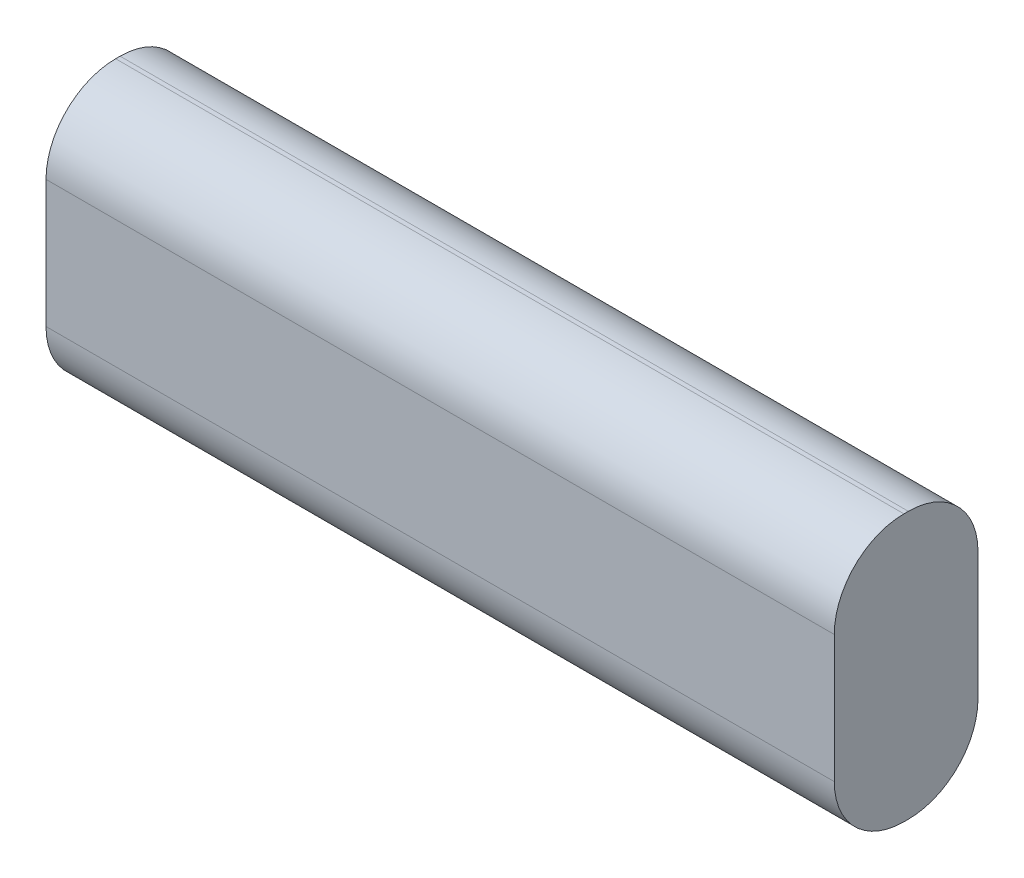
ISO-10303-21;
HEADER;
FILE_DESCRIPTION(('STEP AP214'),'2;1');
FILE_NAME('part.step','',(''),(''),'','','');
FILE_SCHEMA(('AUTOMOTIVE_DESIGN { 1 0 10303 214 1 1 1 1 }'));
ENDSEC;
DATA;
#1=APPLICATION_CONTEXT('core data for automotive mechanical design processes');
#2=APPLICATION_PROTOCOL_DEFINITION('international standard','automotive_design',2000,#1);
#3=PRODUCT_CONTEXT('',#1,'mechanical');
#4=PRODUCT('Part','Part','',(#3));
#5=PRODUCT_RELATED_PRODUCT_CATEGORY('part','',(#4));
#6=PRODUCT_DEFINITION_FORMATION('','',#4);
#7=PRODUCT_DEFINITION_CONTEXT('part definition',#1,'design');
#8=PRODUCT_DEFINITION('design','',#6,#7);
#9=PRODUCT_DEFINITION_SHAPE('','',#8);
#10=(LENGTH_UNIT() NAMED_UNIT(*) SI_UNIT(.MILLI.,.METRE.));
#11=(NAMED_UNIT(*) PLANE_ANGLE_UNIT() SI_UNIT($,.RADIAN.));
#12=(NAMED_UNIT(*) SI_UNIT($,.STERADIAN.) SOLID_ANGLE_UNIT());
#13=UNCERTAINTY_MEASURE_WITH_UNIT(LENGTH_MEASURE(1.E-05),#10,'distance_accuracy_value','');
#14=(GEOMETRIC_REPRESENTATION_CONTEXT(3) GLOBAL_UNCERTAINTY_ASSIGNED_CONTEXT((#13)) GLOBAL_UNIT_ASSIGNED_CONTEXT((#10,
#11,#12)) REPRESENTATION_CONTEXT('',''));
#15=CARTESIAN_POINT('',(0.,0.,0.));
#16=DIRECTION('',(0.,0.,1.));
#17=DIRECTION('',(1.,0.,0.));
#18=AXIS2_PLACEMENT_3D('',#15,#16,#17);
#19=CARTESIAN_POINT('',(0.,0.,24.25));
#20=DIRECTION('',(1.,0.,0.));
#21=DIRECTION('',(0.,1.,0.));
#22=AXIS2_PLACEMENT_3D('',#19,#20,#21);
#23=PLANE('',#22);
#24=DIRECTION('',(0.,-1.,0.));
#25=VECTOR('',#24,1.);
#26=CARTESIAN_POINT('',(0.,0.,0.));
#27=LINE('',#26,#25);
#28=CARTESIAN_POINT('',(0.,-11.75,0.));
#29=VERTEX_POINT('',#28);
#30=CARTESIAN_POINT('',(0.,-33.25,0.));
#31=VERTEX_POINT('',#30);
#32=EDGE_CURVE('E164',#29,#31,#27,.T.);
#33=ORIENTED_EDGE('',*,*,#32,.T.);
#34=CARTESIAN_POINT('',(0.,-33.25,11.75));
#35=DIRECTION('',(1.,0.,0.));
#36=DIRECTION('',(0.,1.,0.));
#37=AXIS2_PLACEMENT_3D('',#34,#35,#36);
#38=CIRCLE('',#37,11.75);
#39=CARTESIAN_POINT('',(0.,-45.,11.75));
#40=VERTEX_POINT('',#39);
#41=EDGE_CURVE('E141',#31,#40,#38,.F.);
#42=ORIENTED_EDGE('',*,*,#41,.T.);
#43=DIRECTION('',(0.,0.,-1.));
#44=VECTOR('',#43,1.);
#45=CARTESIAN_POINT('',(0.,-45.,24.25));
#46=LINE('',#45,#44);
#47=CARTESIAN_POINT('',(0.,-45.,12.5));
#48=VERTEX_POINT('',#47);
#49=EDGE_CURVE('E120',#48,#40,#46,.T.);
#50=ORIENTED_EDGE('',*,*,#49,.F.);
#51=CARTESIAN_POINT('',(0.,-33.25,12.5));
#52=DIRECTION('',(1.,0.,0.));
#53=DIRECTION('',(0.,1.,0.));
#54=AXIS2_PLACEMENT_3D('',#51,#52,#53);
#55=CIRCLE('',#54,11.75);
#56=CARTESIAN_POINT('',(0.,-33.25,24.25));
#57=VERTEX_POINT('',#56);
#58=EDGE_CURVE('E125',#48,#57,#55,.F.);
#59=ORIENTED_EDGE('',*,*,#58,.T.);
#60=DIRECTION('',(0.,-1.,0.));
#61=VECTOR('',#60,1.);
#62=CARTESIAN_POINT('',(0.,0.,24.25));
#63=LINE('',#62,#61);
#64=CARTESIAN_POINT('',(0.,-11.75,24.25));
#65=VERTEX_POINT('',#64);
#66=EDGE_CURVE('E158',#65,#57,#63,.T.);
#67=ORIENTED_EDGE('',*,*,#66,.F.);
#68=CARTESIAN_POINT('',(0.,-11.75,12.5));
#69=DIRECTION('',(1.,0.,0.));
#70=DIRECTION('',(0.,1.,0.));
#71=AXIS2_PLACEMENT_3D('',#68,#69,#70);
#72=CIRCLE('',#71,11.75);
#73=CARTESIAN_POINT('',(0.,0.,12.5));
#74=VERTEX_POINT('',#73);
#75=EDGE_CURVE('E56',#65,#74,#72,.F.);
#76=ORIENTED_EDGE('',*,*,#75,.T.);
#77=DIRECTION('',(0.,0.,-1.));
#78=VECTOR('',#77,1.);
#79=CARTESIAN_POINT('',(0.,0.,24.25));
#80=LINE('',#79,#78);
#81=CARTESIAN_POINT('',(0.,0.,11.75));
#82=VERTEX_POINT('',#81);
#83=EDGE_CURVE('E150',#74,#82,#80,.T.);
#84=ORIENTED_EDGE('',*,*,#83,.T.);
#85=CARTESIAN_POINT('',(0.,-11.75,11.75));
#86=DIRECTION('',(1.,0.,0.));
#87=DIRECTION('',(0.,1.,0.));
#88=AXIS2_PLACEMENT_3D('',#85,#86,#87);
#89=CIRCLE('',#88,11.75);
#90=EDGE_CURVE('E48',#82,#29,#89,.F.);
#91=ORIENTED_EDGE('',*,*,#90,.T.);
#92=EDGE_LOOP('',(#33,#42,#50,#59,#67,#76,#84,#91));
#93=FACE_BOUND('',#92,.T.);
#94=ADVANCED_FACE('F33',(#93),#23,.F.);
#95=CARTESIAN_POINT('',(0.,-45.,24.25));
#96=DIRECTION('',(0.,1.,0.));
#97=DIRECTION('',(0.,0.,1.));
#98=AXIS2_PLACEMENT_3D('',#95,#96,#97);
#99=PLANE('',#98);
#100=ORIENTED_EDGE('',*,*,#49,.T.);
#101=DIRECTION('',(1.,0.,0.));
#102=VECTOR('',#101,1.);
#103=CARTESIAN_POINT('',(0.,-45.,11.75));
#104=LINE('',#103,#102);
#105=CARTESIAN_POINT('',(133.,-45.,11.75));
#106=VERTEX_POINT('',#105);
#107=EDGE_CURVE('E119',#40,#106,#104,.T.);
#108=ORIENTED_EDGE('',*,*,#107,.T.);
#109=DIRECTION('',(0.,0.,-1.));
#110=VECTOR('',#109,1.);
#111=CARTESIAN_POINT('',(133.,-45.,24.25));
#112=LINE('',#111,#110);
#113=CARTESIAN_POINT('',(133.,-45.,12.5));
#114=VERTEX_POINT('',#113);
#115=EDGE_CURVE('E102',#114,#106,#112,.T.);
#116=ORIENTED_EDGE('',*,*,#115,.F.);
#117=DIRECTION('',(1.,0.,0.));
#118=VECTOR('',#117,1.);
#119=CARTESIAN_POINT('',(0.,-45.,12.5));
#120=LINE('',#119,#118);
#121=EDGE_CURVE('E116',#114,#48,#120,.F.);
#122=ORIENTED_EDGE('',*,*,#121,.T.);
#123=EDGE_LOOP('',(#100,#108,#116,#122));
#124=FACE_BOUND('',#123,.T.);
#125=ADVANCED_FACE('F115',(#124),#99,.F.);
#126=CARTESIAN_POINT('',(133.,0.,24.25));
#127=DIRECTION('',(-1.,0.,0.));
#128=DIRECTION('',(0.,0.,1.));
#129=AXIS2_PLACEMENT_3D('',#126,#127,#128);
#130=PLANE('',#129);
#131=ORIENTED_EDGE('',*,*,#115,.T.);
#132=CARTESIAN_POINT('',(133.,-33.25,11.75));
#133=DIRECTION('',(-1.,0.,0.));
#134=DIRECTION('',(0.,0.,1.));
#135=AXIS2_PLACEMENT_3D('',#132,#133,#134);
#136=CIRCLE('',#135,11.75);
#137=CARTESIAN_POINT('',(133.,-33.25,0.));
#138=VERTEX_POINT('',#137);
#139=EDGE_CURVE('E109',#106,#138,#136,.F.);
#140=ORIENTED_EDGE('',*,*,#139,.T.);
#141=DIRECTION('',(0.,1.,0.));
#142=VECTOR('',#141,1.);
#143=CARTESIAN_POINT('',(133.,0.,0.));
#144=LINE('',#143,#142);
#145=CARTESIAN_POINT('',(133.,-11.75,0.));
#146=VERTEX_POINT('',#145);
#147=EDGE_CURVE('E161',#138,#146,#144,.T.);
#148=ORIENTED_EDGE('',*,*,#147,.T.);
#149=CARTESIAN_POINT('',(133.,-11.75,11.75));
#150=DIRECTION('',(-1.,0.,0.));
#151=DIRECTION('',(0.,0.,1.));
#152=AXIS2_PLACEMENT_3D('',#149,#150,#151);
#153=CIRCLE('',#152,11.75);
#154=CARTESIAN_POINT('',(133.,0.,11.75));
#155=VERTEX_POINT('',#154);
#156=EDGE_CURVE('E127',#146,#155,#153,.F.);
#157=ORIENTED_EDGE('',*,*,#156,.T.);
#158=DIRECTION('',(0.,0.,-1.));
#159=VECTOR('',#158,1.);
#160=CARTESIAN_POINT('',(133.,0.,24.25));
#161=LINE('',#160,#159);
#162=CARTESIAN_POINT('',(133.,0.,12.5));
#163=VERTEX_POINT('',#162);
#164=EDGE_CURVE('E121',#163,#155,#161,.T.);
#165=ORIENTED_EDGE('',*,*,#164,.F.);
#166=CARTESIAN_POINT('',(133.,-11.75,12.5));
#167=DIRECTION('',(-1.,0.,0.));
#168=DIRECTION('',(0.,0.,1.));
#169=AXIS2_PLACEMENT_3D('',#166,#167,#168);
#170=CIRCLE('',#169,11.75);
#171=CARTESIAN_POINT('',(133.,-11.75,24.25));
#172=VERTEX_POINT('',#171);
#173=EDGE_CURVE('E110',#163,#172,#170,.F.);
#174=ORIENTED_EDGE('',*,*,#173,.T.);
#175=DIRECTION('',(0.,1.,0.));
#176=VECTOR('',#175,1.);
#177=CARTESIAN_POINT('',(133.,0.,24.25));
#178=LINE('',#177,#176);
#179=CARTESIAN_POINT('',(133.,-33.25,24.25));
#180=VERTEX_POINT('',#179);
#181=EDGE_CURVE('E104',#180,#172,#178,.T.);
#182=ORIENTED_EDGE('',*,*,#181,.F.);
#183=CARTESIAN_POINT('',(133.,-33.25,12.5));
#184=DIRECTION('',(-1.,0.,0.));
#185=DIRECTION('',(0.,0.,1.));
#186=AXIS2_PLACEMENT_3D('',#183,#184,#185);
#187=CIRCLE('',#186,11.75);
#188=EDGE_CURVE('E99',#180,#114,#187,.F.);
#189=ORIENTED_EDGE('',*,*,#188,.T.);
#190=EDGE_LOOP('',(#131,#140,#148,#157,#165,#174,#182,#189));
#191=FACE_BOUND('',#190,.T.);
#192=ADVANCED_FACE('F101',(#191),#130,.F.);
#193=CARTESIAN_POINT('',(0.,0.,24.25));
#194=DIRECTION('',(0.,-1.,0.));
#195=DIRECTION('',(0.,0.,-1.));
#196=AXIS2_PLACEMENT_3D('',#193,#194,#195);
#197=PLANE('',#196);
#198=ORIENTED_EDGE('',*,*,#83,.F.);
#199=DIRECTION('',(-1.,0.,0.));
#200=VECTOR('',#199,1.);
#201=CARTESIAN_POINT('',(133.,0.,12.5));
#202=LINE('',#201,#200);
#203=EDGE_CURVE('E11',#74,#163,#202,.F.);
#204=ORIENTED_EDGE('',*,*,#203,.T.);
#205=ORIENTED_EDGE('',*,*,#164,.T.);
#206=DIRECTION('',(-1.,0.,0.));
#207=VECTOR('',#206,1.);
#208=CARTESIAN_POINT('',(0.,0.,11.75));
#209=LINE('',#208,#207);
#210=EDGE_CURVE('E41',#155,#82,#209,.T.);
#211=ORIENTED_EDGE('',*,*,#210,.T.);
#212=EDGE_LOOP('',(#198,#204,#205,#211));
#213=FACE_BOUND('',#212,.T.);
#214=ADVANCED_FACE('F149',(#213),#197,.F.);
#215=CARTESIAN_POINT('',(0.,0.,24.25));
#216=DIRECTION('',(0.,0.,1.));
#217=DIRECTION('',(1.,0.,0.));
#218=AXIS2_PLACEMENT_3D('',#215,#216,#217);
#219=PLANE('',#218);
#220=ORIENTED_EDGE('',*,*,#66,.T.);
#221=DIRECTION('',(1.,0.,0.));
#222=VECTOR('',#221,1.);
#223=CARTESIAN_POINT('',(133.,-33.25,24.25));
#224=LINE('',#223,#222);
#225=EDGE_CURVE('E146',#57,#180,#224,.T.);
#226=ORIENTED_EDGE('',*,*,#225,.T.);
#227=ORIENTED_EDGE('',*,*,#181,.T.);
#228=DIRECTION('',(-1.,0.,0.));
#229=VECTOR('',#228,1.);
#230=CARTESIAN_POINT('',(0.,-11.75,24.25));
#231=LINE('',#230,#229);
#232=EDGE_CURVE('E143',#172,#65,#231,.T.);
#233=ORIENTED_EDGE('',*,*,#232,.T.);
#234=EDGE_LOOP('',(#220,#226,#227,#233));
#235=FACE_BOUND('',#234,.T.);
#236=ADVANCED_FACE('F168',(#235),#219,.T.);
#237=CARTESIAN_POINT('',(0.,0.,0.));
#238=DIRECTION('',(0.,0.,1.));
#239=DIRECTION('',(1.,0.,0.));
#240=AXIS2_PLACEMENT_3D('',#237,#238,#239);
#241=PLANE('',#240);
#242=ORIENTED_EDGE('',*,*,#147,.F.);
#243=DIRECTION('',(1.,0.,0.));
#244=VECTOR('',#243,1.);
#245=CARTESIAN_POINT('',(0.,-33.25,0.));
#246=LINE('',#245,#244);
#247=EDGE_CURVE('E136',#138,#31,#246,.F.);
#248=ORIENTED_EDGE('',*,*,#247,.T.);
#249=ORIENTED_EDGE('',*,*,#32,.F.);
#250=DIRECTION('',(-1.,0.,0.));
#251=VECTOR('',#250,1.);
#252=CARTESIAN_POINT('',(0.,-11.75,0.));
#253=LINE('',#252,#251);
#254=EDGE_CURVE('E134',#29,#146,#253,.F.);
#255=ORIENTED_EDGE('',*,*,#254,.T.);
#256=EDGE_LOOP('',(#242,#248,#249,#255));
#257=FACE_BOUND('',#256,.T.);
#258=ADVANCED_FACE('F176',(#257),#241,.F.);
#259=CARTESIAN_POINT('',(0.,-33.25,11.75));
#260=DIRECTION('',(1.,0.,0.));
#261=DIRECTION('',(0.,0.,-1.));
#262=AXIS2_PLACEMENT_3D('',#259,#260,#261);
#263=CYLINDRICAL_SURFACE('',#262,11.75);
#264=ORIENTED_EDGE('',*,*,#41,.F.);
#265=ORIENTED_EDGE('',*,*,#247,.F.);
#266=ORIENTED_EDGE('',*,*,#139,.F.);
#267=ORIENTED_EDGE('',*,*,#107,.F.);
#268=EDGE_LOOP('',(#264,#265,#266,#267));
#269=FACE_BOUND('',#268,.T.);
#270=ADVANCED_FACE('F172',(#269),#263,.T.);
#271=CARTESIAN_POINT('',(0.,-33.25,12.5));
#272=DIRECTION('',(-1.,0.,0.));
#273=DIRECTION('',(0.,0.,1.));
#274=AXIS2_PLACEMENT_3D('',#271,#272,#273);
#275=CYLINDRICAL_SURFACE('',#274,11.75);
#276=ORIENTED_EDGE('',*,*,#58,.F.);
#277=ORIENTED_EDGE('',*,*,#121,.F.);
#278=ORIENTED_EDGE('',*,*,#188,.F.);
#279=ORIENTED_EDGE('',*,*,#225,.F.);
#280=EDGE_LOOP('',(#276,#277,#278,#279));
#281=FACE_BOUND('',#280,.T.);
#282=ADVANCED_FACE('F124',(#281),#275,.T.);
#283=CARTESIAN_POINT('',(0.,-11.75,12.5));
#284=DIRECTION('',(1.,0.,0.));
#285=DIRECTION('',(0.,0.,-1.));
#286=AXIS2_PLACEMENT_3D('',#283,#284,#285);
#287=CYLINDRICAL_SURFACE('',#286,11.75);
#288=ORIENTED_EDGE('',*,*,#173,.F.);
#289=ORIENTED_EDGE('',*,*,#203,.F.);
#290=ORIENTED_EDGE('',*,*,#75,.F.);
#291=ORIENTED_EDGE('',*,*,#232,.F.);
#292=EDGE_LOOP('',(#288,#289,#290,#291));
#293=FACE_BOUND('',#292,.T.);
#294=ADVANCED_FACE('F179',(#293),#287,.T.);
#295=CARTESIAN_POINT('',(0.,-11.75,11.75));
#296=DIRECTION('',(-1.,0.,0.));
#297=DIRECTION('',(0.,0.,1.));
#298=AXIS2_PLACEMENT_3D('',#295,#296,#297);
#299=CYLINDRICAL_SURFACE('',#298,11.75);
#300=ORIENTED_EDGE('',*,*,#156,.F.);
#301=ORIENTED_EDGE('',*,*,#254,.F.);
#302=ORIENTED_EDGE('',*,*,#90,.F.);
#303=ORIENTED_EDGE('',*,*,#210,.F.);
#304=EDGE_LOOP('',(#300,#301,#302,#303));
#305=FACE_BOUND('',#304,.T.);
#306=ADVANCED_FACE('F35',(#305),#299,.T.);
#307=CLOSED_SHELL('',(#94,#125,#192,#214,#236,#258,#270,#282,#294,#306));
#308=MANIFOLD_SOLID_BREP('B2',#307);
#309=ADVANCED_BREP_SHAPE_REPRESENTATION('',(#18,#308),#14);
#310=SHAPE_DEFINITION_REPRESENTATION(#9,#309);
ENDSEC;
END-ISO-10303-21;
